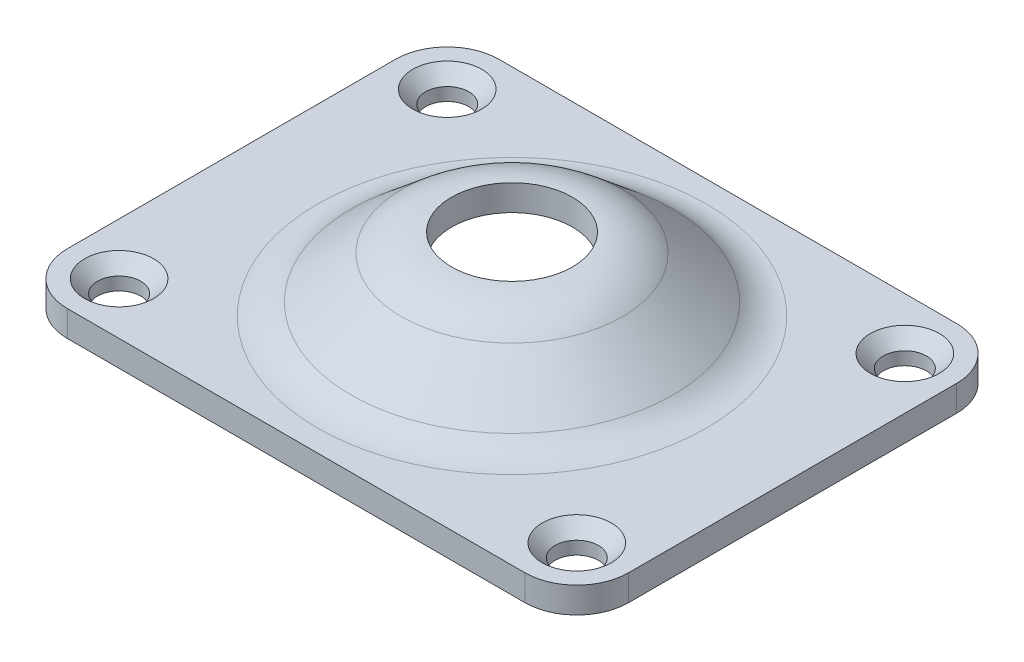
ISO-10303-21;
HEADER;
FILE_DESCRIPTION(('STEP AP214'),'2;1');
FILE_NAME('part.step','',(''),(''),'','','');
FILE_SCHEMA(('AUTOMOTIVE_DESIGN { 1 0 10303 214 1 1 1 1 }'));
ENDSEC;
DATA;
#1=APPLICATION_CONTEXT('core data for automotive mechanical design processes');
#2=APPLICATION_PROTOCOL_DEFINITION('international standard','automotive_design',2000,#1);
#3=PRODUCT_CONTEXT('',#1,'mechanical');
#4=PRODUCT('Part','Part','',(#3));
#5=PRODUCT_RELATED_PRODUCT_CATEGORY('part','',(#4));
#6=PRODUCT_DEFINITION_FORMATION('','',#4);
#7=PRODUCT_DEFINITION_CONTEXT('part definition',#1,'design');
#8=PRODUCT_DEFINITION('design','',#6,#7);
#9=PRODUCT_DEFINITION_SHAPE('','',#8);
#10=(LENGTH_UNIT() NAMED_UNIT(*) SI_UNIT(.MILLI.,.METRE.));
#11=(NAMED_UNIT(*) PLANE_ANGLE_UNIT() SI_UNIT($,.RADIAN.));
#12=(NAMED_UNIT(*) SI_UNIT($,.STERADIAN.) SOLID_ANGLE_UNIT());
#13=UNCERTAINTY_MEASURE_WITH_UNIT(LENGTH_MEASURE(1.E-05),#10,'distance_accuracy_value','');
#14=(GEOMETRIC_REPRESENTATION_CONTEXT(3) GLOBAL_UNCERTAINTY_ASSIGNED_CONTEXT((#13)) GLOBAL_UNIT_ASSIGNED_CONTEXT((#10,
#11,#12)) REPRESENTATION_CONTEXT('',''));
#15=CARTESIAN_POINT('',(0.,0.,0.));
#16=DIRECTION('',(0.,0.,1.));
#17=DIRECTION('',(1.,0.,0.));
#18=AXIS2_PLACEMENT_3D('',#15,#16,#17);
#19=CARTESIAN_POINT('',(-26.5,3.,19.));
#20=DIRECTION('',(0.,1.,0.));
#21=DIRECTION('',(0.,0.,1.));
#22=AXIS2_PLACEMENT_3D('',#19,#20,#21);
#23=PLANE('',#22);
#24=CARTESIAN_POINT('',(-26.5,3.,19.));
#25=DIRECTION('',(0.,1.,0.));
#26=DIRECTION('',(0.,0.,1.));
#27=AXIS2_PLACEMENT_3D('',#24,#25,#26);
#28=CIRCLE('',#27,4.00000000000003);
#29=CARTESIAN_POINT('',(-26.5,3.,23.));
#30=VERTEX_POINT('',#29);
#31=EDGE_CURVE('E212',#30,#30,#28,.F.);
#32=ORIENTED_EDGE('',*,*,#31,.T.);
#33=EDGE_LOOP('',(#32));
#34=FACE_BOUND('',#33,.T.);
#35=CARTESIAN_POINT('',(26.5,3.,19.));
#36=DIRECTION('',(0.,1.,0.));
#37=DIRECTION('',(0.,0.,1.));
#38=AXIS2_PLACEMENT_3D('',#35,#36,#37);
#39=CIRCLE('',#38,4.00000000000003);
#40=CARTESIAN_POINT('',(26.5,3.,23.));
#41=VERTEX_POINT('',#40);
#42=EDGE_CURVE('E208',#41,#41,#39,.F.);
#43=ORIENTED_EDGE('',*,*,#42,.T.);
#44=EDGE_LOOP('',(#43));
#45=FACE_BOUND('',#44,.T.);
#46=CARTESIAN_POINT('',(26.5,3.,-19.));
#47=DIRECTION('',(0.,1.,0.));
#48=DIRECTION('',(0.,0.,1.));
#49=AXIS2_PLACEMENT_3D('',#46,#47,#48);
#50=CIRCLE('',#49,4.00000000000003);
#51=CARTESIAN_POINT('',(26.5,3.,-15.));
#52=VERTEX_POINT('',#51);
#53=EDGE_CURVE('E204',#52,#52,#50,.F.);
#54=ORIENTED_EDGE('',*,*,#53,.T.);
#55=EDGE_LOOP('',(#54));
#56=FACE_BOUND('',#55,.T.);
#57=CARTESIAN_POINT('',(-26.5,3.,-19.));
#58=DIRECTION('',(0.,1.,0.));
#59=DIRECTION('',(0.,0.,1.));
#60=AXIS2_PLACEMENT_3D('',#57,#58,#59);
#61=CIRCLE('',#60,4.00000000000003);
#62=CARTESIAN_POINT('',(-26.5,3.,-15.));
#63=VERTEX_POINT('',#62);
#64=EDGE_CURVE('E200',#63,#63,#61,.F.);
#65=ORIENTED_EDGE('',*,*,#64,.T.);
#66=EDGE_LOOP('',(#65));
#67=FACE_BOUND('',#66,.T.);
#68=CARTESIAN_POINT('',(-26.5,3.,19.));
#69=DIRECTION('',(0.,1.,0.));
#70=DIRECTION('',(0.,0.,1.));
#71=AXIS2_PLACEMENT_3D('',#68,#69,#70);
#72=CIRCLE('',#71,6.);
#73=CARTESIAN_POINT('',(-32.5,3.,19.));
#74=VERTEX_POINT('',#73);
#75=CARTESIAN_POINT('',(-26.5,3.,25.));
#76=VERTEX_POINT('',#75);
#77=EDGE_CURVE('E174',#74,#76,#72,.T.);
#78=ORIENTED_EDGE('',*,*,#77,.T.);
#79=DIRECTION('',(1.,0.,0.));
#80=VECTOR('',#79,1.);
#81=CARTESIAN_POINT('',(-26.5,3.,25.));
#82=LINE('',#81,#80);
#83=CARTESIAN_POINT('',(26.5,3.,25.));
#84=VERTEX_POINT('',#83);
#85=EDGE_CURVE('E110',#76,#84,#82,.T.);
#86=ORIENTED_EDGE('',*,*,#85,.T.);
#87=CARTESIAN_POINT('',(26.5,3.,19.));
#88=DIRECTION('',(0.,1.,0.));
#89=DIRECTION('',(0.,0.,1.));
#90=AXIS2_PLACEMENT_3D('',#87,#88,#89);
#91=CIRCLE('',#90,6.);
#92=CARTESIAN_POINT('',(32.5,3.,19.));
#93=VERTEX_POINT('',#92);
#94=EDGE_CURVE('E332',#84,#93,#91,.T.);
#95=ORIENTED_EDGE('',*,*,#94,.T.);
#96=DIRECTION('',(0.,0.,-1.));
#97=VECTOR('',#96,1.);
#98=CARTESIAN_POINT('',(32.5,3.,-19.));
#99=LINE('',#98,#97);
#100=CARTESIAN_POINT('',(32.5,3.,-19.));
#101=VERTEX_POINT('',#100);
#102=EDGE_CURVE('E335',#93,#101,#99,.T.);
#103=ORIENTED_EDGE('',*,*,#102,.T.);
#104=CARTESIAN_POINT('',(26.5,3.,-19.));
#105=DIRECTION('',(0.,1.,0.));
#106=DIRECTION('',(0.,0.,-1.));
#107=AXIS2_PLACEMENT_3D('',#104,#105,#106);
#108=CIRCLE('',#107,6.);
#109=CARTESIAN_POINT('',(26.5,3.,-25.));
#110=VERTEX_POINT('',#109);
#111=EDGE_CURVE('E129',#101,#110,#108,.T.);
#112=ORIENTED_EDGE('',*,*,#111,.T.);
#113=DIRECTION('',(-1.,0.,0.));
#114=VECTOR('',#113,1.);
#115=CARTESIAN_POINT('',(-26.5,3.,-25.));
#116=LINE('',#115,#114);
#117=CARTESIAN_POINT('',(-26.5,3.,-25.));
#118=VERTEX_POINT('',#117);
#119=EDGE_CURVE('E123',#110,#118,#116,.T.);
#120=ORIENTED_EDGE('',*,*,#119,.T.);
#121=CARTESIAN_POINT('',(-26.5,3.,-19.));
#122=DIRECTION('',(0.,1.,0.));
#123=DIRECTION('',(0.,0.,1.));
#124=AXIS2_PLACEMENT_3D('',#121,#122,#123);
#125=CIRCLE('',#124,6.);
#126=CARTESIAN_POINT('',(-32.5,3.,-19.));
#127=VERTEX_POINT('',#126);
#128=EDGE_CURVE('E127',#118,#127,#125,.T.);
#129=ORIENTED_EDGE('',*,*,#128,.T.);
#130=DIRECTION('',(0.,0.,1.));
#131=VECTOR('',#130,1.);
#132=CARTESIAN_POINT('',(-32.5,3.,-19.));
#133=LINE('',#132,#131);
#134=EDGE_CURVE('E66',#127,#74,#133,.T.);
#135=ORIENTED_EDGE('',*,*,#134,.T.);
#136=EDGE_LOOP('',(#78,#86,#95,#103,#112,#120,#129,#135));
#137=FACE_BOUND('',#136,.T.);
#138=CARTESIAN_POINT('',(0.,3.,0.));
#139=DIRECTION('',(0.,1.,0.));
#140=DIRECTION('',(0.,0.,1.));
#141=AXIS2_PLACEMENT_3D('',#138,#139,#140);
#142=CIRCLE('',#141,22.5);
#143=CARTESIAN_POINT('',(0.,3.,22.5));
#144=VERTEX_POINT('',#143);
#145=EDGE_CURVE('E321',#144,#144,#142,.T.);
#146=ORIENTED_EDGE('',*,*,#145,.F.);
#147=EDGE_LOOP('',(#146));
#148=FACE_BOUND('',#147,.T.);
#149=ADVANCED_FACE('F47',(#34,#45,#56,#67,#137,#148),#23,.T.);
#150=CARTESIAN_POINT('',(-26.5,0.,19.));
#151=DIRECTION('',(0.,1.,0.));
#152=DIRECTION('',(0.,0.,1.));
#153=AXIS2_PLACEMENT_3D('',#150,#151,#152);
#154=PLANE('',#153);
#155=CARTESIAN_POINT('',(-26.5,0.,19.));
#156=DIRECTION('',(0.,1.,0.));
#157=DIRECTION('',(0.,0.,1.));
#158=AXIS2_PLACEMENT_3D('',#155,#156,#157);
#159=CIRCLE('',#158,6.);
#160=CARTESIAN_POINT('',(-32.5,0.,19.));
#161=VERTEX_POINT('',#160);
#162=CARTESIAN_POINT('',(-26.5,0.,25.));
#163=VERTEX_POINT('',#162);
#164=EDGE_CURVE('E151',#161,#163,#159,.T.);
#165=ORIENTED_EDGE('',*,*,#164,.F.);
#166=DIRECTION('',(0.,0.,1.));
#167=VECTOR('',#166,1.);
#168=CARTESIAN_POINT('',(-32.5,0.,-19.));
#169=LINE('',#168,#167);
#170=CARTESIAN_POINT('',(-32.5,0.,-19.));
#171=VERTEX_POINT('',#170);
#172=EDGE_CURVE('E101',#171,#161,#169,.T.);
#173=ORIENTED_EDGE('',*,*,#172,.F.);
#174=CARTESIAN_POINT('',(-26.5,0.,-19.));
#175=DIRECTION('',(0.,1.,0.));
#176=DIRECTION('',(0.,0.,1.));
#177=AXIS2_PLACEMENT_3D('',#174,#175,#176);
#178=CIRCLE('',#177,6.);
#179=CARTESIAN_POINT('',(-26.5,0.,-25.));
#180=VERTEX_POINT('',#179);
#181=EDGE_CURVE('E95',#180,#171,#178,.T.);
#182=ORIENTED_EDGE('',*,*,#181,.F.);
#183=DIRECTION('',(-1.,0.,0.));
#184=VECTOR('',#183,1.);
#185=CARTESIAN_POINT('',(-26.5,0.,-25.));
#186=LINE('',#185,#184);
#187=CARTESIAN_POINT('',(26.5,0.,-25.));
#188=VERTEX_POINT('',#187);
#189=EDGE_CURVE('E138',#188,#180,#186,.T.);
#190=ORIENTED_EDGE('',*,*,#189,.F.);
#191=CARTESIAN_POINT('',(26.5,0.,-19.));
#192=DIRECTION('',(0.,1.,0.));
#193=DIRECTION('',(0.,0.,-1.));
#194=AXIS2_PLACEMENT_3D('',#191,#192,#193);
#195=CIRCLE('',#194,6.);
#196=CARTESIAN_POINT('',(32.5,0.,-19.));
#197=VERTEX_POINT('',#196);
#198=EDGE_CURVE('E165',#197,#188,#195,.T.);
#199=ORIENTED_EDGE('',*,*,#198,.F.);
#200=DIRECTION('',(0.,0.,-1.));
#201=VECTOR('',#200,1.);
#202=CARTESIAN_POINT('',(32.5,0.,-19.));
#203=LINE('',#202,#201);
#204=CARTESIAN_POINT('',(32.5,0.,19.));
#205=VERTEX_POINT('',#204);
#206=EDGE_CURVE('E162',#205,#197,#203,.T.);
#207=ORIENTED_EDGE('',*,*,#206,.F.);
#208=CARTESIAN_POINT('',(26.5,0.,19.));
#209=DIRECTION('',(0.,1.,0.));
#210=DIRECTION('',(0.,0.,1.));
#211=AXIS2_PLACEMENT_3D('',#208,#209,#210);
#212=CIRCLE('',#211,6.);
#213=CARTESIAN_POINT('',(26.5,0.,25.));
#214=VERTEX_POINT('',#213);
#215=EDGE_CURVE('E159',#214,#205,#212,.T.);
#216=ORIENTED_EDGE('',*,*,#215,.F.);
#217=DIRECTION('',(1.,0.,0.));
#218=VECTOR('',#217,1.);
#219=CARTESIAN_POINT('',(-26.5,0.,25.));
#220=LINE('',#219,#218);
#221=EDGE_CURVE('E155',#163,#214,#220,.T.);
#222=ORIENTED_EDGE('',*,*,#221,.F.);
#223=EDGE_LOOP('',(#165,#173,#182,#190,#199,#207,#216,#222));
#224=FACE_BOUND('',#223,.T.);
#225=CARTESIAN_POINT('',(-26.5,0.,-19.));
#226=DIRECTION('',(0.,1.,0.));
#227=DIRECTION('',(0.,0.,1.));
#228=AXIS2_PLACEMENT_3D('',#225,#226,#227);
#229=CIRCLE('',#228,2.5);
#230=CARTESIAN_POINT('',(-26.5,0.,-16.5));
#231=VERTEX_POINT('',#230);
#232=EDGE_CURVE('E156',#231,#231,#229,.T.);
#233=ORIENTED_EDGE('',*,*,#232,.T.);
#234=EDGE_LOOP('',(#233));
#235=FACE_BOUND('',#234,.T.);
#236=CARTESIAN_POINT('',(26.5,0.,-19.));
#237=DIRECTION('',(0.,1.,0.));
#238=DIRECTION('',(0.,0.,1.));
#239=AXIS2_PLACEMENT_3D('',#236,#237,#238);
#240=CIRCLE('',#239,2.5);
#241=CARTESIAN_POINT('',(26.5,0.,-16.5));
#242=VERTEX_POINT('',#241);
#243=EDGE_CURVE('E313',#242,#242,#240,.T.);
#244=ORIENTED_EDGE('',*,*,#243,.T.);
#245=EDGE_LOOP('',(#244));
#246=FACE_BOUND('',#245,.T.);
#247=CARTESIAN_POINT('',(-26.5,0.,19.));
#248=DIRECTION('',(0.,1.,0.));
#249=DIRECTION('',(0.,0.,1.));
#250=AXIS2_PLACEMENT_3D('',#247,#248,#249);
#251=CIRCLE('',#250,2.5);
#252=CARTESIAN_POINT('',(-26.5,0.,21.5));
#253=VERTEX_POINT('',#252);
#254=EDGE_CURVE('E310',#253,#253,#251,.T.);
#255=ORIENTED_EDGE('',*,*,#254,.T.);
#256=EDGE_LOOP('',(#255));
#257=FACE_BOUND('',#256,.T.);
#258=CARTESIAN_POINT('',(26.5,0.,19.));
#259=DIRECTION('',(0.,1.,0.));
#260=DIRECTION('',(0.,0.,1.));
#261=AXIS2_PLACEMENT_3D('',#258,#259,#260);
#262=CIRCLE('',#261,2.5);
#263=CARTESIAN_POINT('',(26.5,0.,21.5));
#264=VERTEX_POINT('',#263);
#265=EDGE_CURVE('E314',#264,#264,#262,.T.);
#266=ORIENTED_EDGE('',*,*,#265,.T.);
#267=EDGE_LOOP('',(#266));
#268=FACE_BOUND('',#267,.T.);
#269=CARTESIAN_POINT('',(0.,0.,0.));
#270=DIRECTION('',(0.,-1.,0.));
#271=DIRECTION('',(0.,0.,-1.));
#272=AXIS2_PLACEMENT_3D('',#269,#270,#271);
#273=CIRCLE('',#272,22.5);
#274=CARTESIAN_POINT('',(0.,0.,-22.5));
#275=VERTEX_POINT('',#274);
#276=EDGE_CURVE('E357',#275,#275,#273,.T.);
#277=ORIENTED_EDGE('',*,*,#276,.F.);
#278=EDGE_LOOP('',(#277));
#279=FACE_BOUND('',#278,.T.);
#280=ADVANCED_FACE('F242',(#224,#235,#246,#257,#268,#279),#154,.F.);
#281=CARTESIAN_POINT('',(-26.5,3.,19.));
#282=DIRECTION('',(0.,-1.,0.));
#283=DIRECTION('',(0.,0.,-1.));
#284=AXIS2_PLACEMENT_3D('',#281,#282,#283);
#285=CYLINDRICAL_SURFACE('',#284,6.);
#286=ORIENTED_EDGE('',*,*,#164,.T.);
#287=DIRECTION('',(0.,-1.,0.));
#288=VECTOR('',#287,1.);
#289=CARTESIAN_POINT('',(-26.5,3.,25.));
#290=LINE('',#289,#288);
#291=EDGE_CURVE('E193',#76,#163,#290,.T.);
#292=ORIENTED_EDGE('',*,*,#291,.F.);
#293=ORIENTED_EDGE('',*,*,#77,.F.);
#294=DIRECTION('',(0.,-1.,0.));
#295=VECTOR('',#294,1.);
#296=CARTESIAN_POINT('',(-32.5,3.,19.));
#297=LINE('',#296,#295);
#298=EDGE_CURVE('E147',#74,#161,#297,.T.);
#299=ORIENTED_EDGE('',*,*,#298,.T.);
#300=EDGE_LOOP('',(#286,#292,#293,#299));
#301=FACE_BOUND('',#300,.T.);
#302=ADVANCED_FACE('F250',(#301),#285,.T.);
#303=CARTESIAN_POINT('',(-26.5,3.,25.));
#304=DIRECTION('',(0.,0.,-1.));
#305=DIRECTION('',(-1.,0.,0.));
#306=AXIS2_PLACEMENT_3D('',#303,#304,#305);
#307=PLANE('',#306);
#308=ORIENTED_EDGE('',*,*,#221,.T.);
#309=DIRECTION('',(0.,-1.,0.));
#310=VECTOR('',#309,1.);
#311=CARTESIAN_POINT('',(26.5,3.,25.));
#312=LINE('',#311,#310);
#313=EDGE_CURVE('E189',#84,#214,#312,.T.);
#314=ORIENTED_EDGE('',*,*,#313,.F.);
#315=ORIENTED_EDGE('',*,*,#85,.F.);
#316=ORIENTED_EDGE('',*,*,#291,.T.);
#317=EDGE_LOOP('',(#308,#314,#315,#316));
#318=FACE_BOUND('',#317,.T.);
#319=ADVANCED_FACE('F275',(#318),#307,.F.);
#320=CARTESIAN_POINT('',(26.5,3.,19.));
#321=DIRECTION('',(0.,-1.,0.));
#322=DIRECTION('',(0.,0.,-1.));
#323=AXIS2_PLACEMENT_3D('',#320,#321,#322);
#324=CYLINDRICAL_SURFACE('',#323,6.);
#325=ORIENTED_EDGE('',*,*,#215,.T.);
#326=DIRECTION('',(0.,-1.,0.));
#327=VECTOR('',#326,1.);
#328=CARTESIAN_POINT('',(32.5,3.,19.));
#329=LINE('',#328,#327);
#330=EDGE_CURVE('E185',#93,#205,#329,.T.);
#331=ORIENTED_EDGE('',*,*,#330,.F.);
#332=ORIENTED_EDGE('',*,*,#94,.F.);
#333=ORIENTED_EDGE('',*,*,#313,.T.);
#334=EDGE_LOOP('',(#325,#331,#332,#333));
#335=FACE_BOUND('',#334,.T.);
#336=ADVANCED_FACE('F271',(#335),#324,.T.);
#337=CARTESIAN_POINT('',(32.5,3.,-19.));
#338=DIRECTION('',(-1.,0.,0.));
#339=DIRECTION('',(0.,0.,1.));
#340=AXIS2_PLACEMENT_3D('',#337,#338,#339);
#341=PLANE('',#340);
#342=ORIENTED_EDGE('',*,*,#206,.T.);
#343=DIRECTION('',(0.,-1.,0.));
#344=VECTOR('',#343,1.);
#345=CARTESIAN_POINT('',(32.5,3.,-19.));
#346=LINE('',#345,#344);
#347=EDGE_CURVE('E181',#101,#197,#346,.T.);
#348=ORIENTED_EDGE('',*,*,#347,.F.);
#349=ORIENTED_EDGE('',*,*,#102,.F.);
#350=ORIENTED_EDGE('',*,*,#330,.T.);
#351=EDGE_LOOP('',(#342,#348,#349,#350));
#352=FACE_BOUND('',#351,.T.);
#353=ADVANCED_FACE('F267',(#352),#341,.F.);
#354=CARTESIAN_POINT('',(26.5,3.,-19.));
#355=DIRECTION('',(0.,-1.,0.));
#356=DIRECTION('',(0.,0.,-1.));
#357=AXIS2_PLACEMENT_3D('',#354,#355,#356);
#358=CYLINDRICAL_SURFACE('',#357,6.);
#359=ORIENTED_EDGE('',*,*,#198,.T.);
#360=DIRECTION('',(0.,-1.,0.));
#361=VECTOR('',#360,1.);
#362=CARTESIAN_POINT('',(26.5,3.,-25.));
#363=LINE('',#362,#361);
#364=EDGE_CURVE('E140',#110,#188,#363,.T.);
#365=ORIENTED_EDGE('',*,*,#364,.F.);
#366=ORIENTED_EDGE('',*,*,#111,.F.);
#367=ORIENTED_EDGE('',*,*,#347,.T.);
#368=EDGE_LOOP('',(#359,#365,#366,#367));
#369=FACE_BOUND('',#368,.T.);
#370=ADVANCED_FACE('F264',(#369),#358,.T.);
#371=CARTESIAN_POINT('',(-26.5,3.,-25.));
#372=DIRECTION('',(0.,0.,1.));
#373=DIRECTION('',(1.,0.,0.));
#374=AXIS2_PLACEMENT_3D('',#371,#372,#373);
#375=PLANE('',#374);
#376=ORIENTED_EDGE('',*,*,#189,.T.);
#377=DIRECTION('',(0.,-1.,0.));
#378=VECTOR('',#377,1.);
#379=CARTESIAN_POINT('',(-26.5,3.,-25.));
#380=LINE('',#379,#378);
#381=EDGE_CURVE('E135',#118,#180,#380,.T.);
#382=ORIENTED_EDGE('',*,*,#381,.F.);
#383=ORIENTED_EDGE('',*,*,#119,.F.);
#384=ORIENTED_EDGE('',*,*,#364,.T.);
#385=EDGE_LOOP('',(#376,#382,#383,#384));
#386=FACE_BOUND('',#385,.T.);
#387=ADVANCED_FACE('F136',(#386),#375,.F.);
#388=CARTESIAN_POINT('',(-26.5,3.,-19.));
#389=DIRECTION('',(0.,-1.,0.));
#390=DIRECTION('',(0.,0.,-1.));
#391=AXIS2_PLACEMENT_3D('',#388,#389,#390);
#392=CYLINDRICAL_SURFACE('',#391,6.);
#393=ORIENTED_EDGE('',*,*,#181,.T.);
#394=DIRECTION('',(0.,-1.,0.));
#395=VECTOR('',#394,1.);
#396=CARTESIAN_POINT('',(-32.5,3.,-19.));
#397=LINE('',#396,#395);
#398=EDGE_CURVE('E141',#127,#171,#397,.T.);
#399=ORIENTED_EDGE('',*,*,#398,.F.);
#400=ORIENTED_EDGE('',*,*,#128,.F.);
#401=ORIENTED_EDGE('',*,*,#381,.T.);
#402=EDGE_LOOP('',(#393,#399,#400,#401));
#403=FACE_BOUND('',#402,.T.);
#404=ADVANCED_FACE('F143',(#403),#392,.T.);
#405=CARTESIAN_POINT('',(-32.5,3.,-19.));
#406=DIRECTION('',(1.,0.,0.));
#407=DIRECTION('',(0.,0.,-1.));
#408=AXIS2_PLACEMENT_3D('',#405,#406,#407);
#409=PLANE('',#408);
#410=ORIENTED_EDGE('',*,*,#172,.T.);
#411=ORIENTED_EDGE('',*,*,#298,.F.);
#412=ORIENTED_EDGE('',*,*,#134,.F.);
#413=ORIENTED_EDGE('',*,*,#398,.T.);
#414=EDGE_LOOP('',(#410,#411,#412,#413));
#415=FACE_BOUND('',#414,.T.);
#416=ADVANCED_FACE('F258',(#415),#409,.F.);
#417=CARTESIAN_POINT('',(-26.5,3.,-19.));
#418=DIRECTION('',(0.,-1.,0.));
#419=DIRECTION('',(0.,0.,-1.));
#420=AXIS2_PLACEMENT_3D('',#417,#418,#419);
#421=CYLINDRICAL_SURFACE('',#420,2.5);
#422=CARTESIAN_POINT('',(-26.5,1.49999999999998,-19.));
#423=DIRECTION('',(0.,1.,0.));
#424=DIRECTION('',(0.,0.,1.));
#425=AXIS2_PLACEMENT_3D('',#422,#423,#424);
#426=CIRCLE('',#425,2.5);
#427=CARTESIAN_POINT('',(-26.5,1.49999999999998,-16.5));
#428=VERTEX_POINT('',#427);
#429=EDGE_CURVE('E11',#428,#428,#426,.T.);
#430=ORIENTED_EDGE('',*,*,#429,.T.);
#431=EDGE_LOOP('',(#430));
#432=FACE_BOUND('',#431,.T.);
#433=ORIENTED_EDGE('',*,*,#232,.F.);
#434=EDGE_LOOP('',(#433));
#435=FACE_BOUND('',#434,.T.);
#436=ADVANCED_FACE('F255',(#432,#435),#421,.F.);
#437=CARTESIAN_POINT('',(26.5,3.,-19.));
#438=DIRECTION('',(0.,-1.,0.));
#439=DIRECTION('',(0.,0.,-1.));
#440=AXIS2_PLACEMENT_3D('',#437,#438,#439);
#441=CYLINDRICAL_SURFACE('',#440,2.5);
#442=CARTESIAN_POINT('',(26.5,1.49999999999998,-19.));
#443=DIRECTION('',(0.,1.,0.));
#444=DIRECTION('',(0.,0.,1.));
#445=AXIS2_PLACEMENT_3D('',#442,#443,#444);
#446=CIRCLE('',#445,2.5);
#447=CARTESIAN_POINT('',(26.5,1.49999999999998,-16.5));
#448=VERTEX_POINT('',#447);
#449=EDGE_CURVE('E58',#448,#448,#446,.T.);
#450=ORIENTED_EDGE('',*,*,#449,.T.);
#451=EDGE_LOOP('',(#450));
#452=FACE_BOUND('',#451,.T.);
#453=ORIENTED_EDGE('',*,*,#243,.F.);
#454=EDGE_LOOP('',(#453));
#455=FACE_BOUND('',#454,.T.);
#456=ADVANCED_FACE('F223',(#452,#455),#441,.F.);
#457=CARTESIAN_POINT('',(-26.5,3.,19.));
#458=DIRECTION('',(0.,-1.,0.));
#459=DIRECTION('',(0.,0.,-1.));
#460=AXIS2_PLACEMENT_3D('',#457,#458,#459);
#461=CYLINDRICAL_SURFACE('',#460,2.5);
#462=CARTESIAN_POINT('',(-26.5,1.49999999999998,19.));
#463=DIRECTION('',(0.,1.,0.));
#464=DIRECTION('',(0.,0.,1.));
#465=AXIS2_PLACEMENT_3D('',#462,#463,#464);
#466=CIRCLE('',#465,2.5);
#467=CARTESIAN_POINT('',(-26.5,1.49999999999998,21.5));
#468=VERTEX_POINT('',#467);
#469=EDGE_CURVE('E196',#468,#468,#466,.T.);
#470=ORIENTED_EDGE('',*,*,#469,.T.);
#471=EDGE_LOOP('',(#470));
#472=FACE_BOUND('',#471,.T.);
#473=ORIENTED_EDGE('',*,*,#254,.F.);
#474=EDGE_LOOP('',(#473));
#475=FACE_BOUND('',#474,.T.);
#476=ADVANCED_FACE('F298',(#472,#475),#461,.F.);
#477=CARTESIAN_POINT('',(26.5,3.,19.));
#478=DIRECTION('',(0.,-1.,0.));
#479=DIRECTION('',(0.,0.,-1.));
#480=AXIS2_PLACEMENT_3D('',#477,#478,#479);
#481=CYLINDRICAL_SURFACE('',#480,2.5);
#482=CARTESIAN_POINT('',(26.5,1.49999999999998,19.));
#483=DIRECTION('',(0.,1.,0.));
#484=DIRECTION('',(0.,0.,1.));
#485=AXIS2_PLACEMENT_3D('',#482,#483,#484);
#486=CIRCLE('',#485,2.5);
#487=CARTESIAN_POINT('',(26.5,1.49999999999998,21.5));
#488=VERTEX_POINT('',#487);
#489=EDGE_CURVE('E216',#488,#488,#486,.T.);
#490=ORIENTED_EDGE('',*,*,#489,.T.);
#491=EDGE_LOOP('',(#490));
#492=FACE_BOUND('',#491,.T.);
#493=ORIENTED_EDGE('',*,*,#265,.F.);
#494=EDGE_LOOP('',(#493));
#495=FACE_BOUND('',#494,.T.);
#496=ADVANCED_FACE('F287',(#492,#495),#481,.F.);
#497=CARTESIAN_POINT('',(-26.5,1.49999999999998,19.));
#498=DIRECTION('',(0.,1.,0.));
#499=DIRECTION('',(0.,0.,1.));
#500=AXIS2_PLACEMENT_3D('',#497,#498,#499);
#501=CONICAL_SURFACE('',#500,2.5,0.78539816339745);
#502=ORIENTED_EDGE('',*,*,#31,.F.);
#503=EDGE_LOOP('',(#502));
#504=FACE_BOUND('',#503,.T.);
#505=ORIENTED_EDGE('',*,*,#469,.F.);
#506=EDGE_LOOP('',(#505));
#507=FACE_BOUND('',#506,.T.);
#508=ADVANCED_FACE('F236',(#504,#507),#501,.F.);
#509=CARTESIAN_POINT('',(26.5,1.49999999999998,19.));
#510=DIRECTION('',(0.,1.,0.));
#511=DIRECTION('',(0.,0.,1.));
#512=AXIS2_PLACEMENT_3D('',#509,#510,#511);
#513=CONICAL_SURFACE('',#512,2.5,0.78539816339745);
#514=ORIENTED_EDGE('',*,*,#42,.F.);
#515=EDGE_LOOP('',(#514));
#516=FACE_BOUND('',#515,.T.);
#517=ORIENTED_EDGE('',*,*,#489,.F.);
#518=EDGE_LOOP('',(#517));
#519=FACE_BOUND('',#518,.T.);
#520=ADVANCED_FACE('F228',(#516,#519),#513,.F.);
#521=CARTESIAN_POINT('',(26.5,1.49999999999998,-19.));
#522=DIRECTION('',(0.,1.,0.));
#523=DIRECTION('',(0.,0.,1.));
#524=AXIS2_PLACEMENT_3D('',#521,#522,#523);
#525=CONICAL_SURFACE('',#524,2.5,0.78539816339745);
#526=ORIENTED_EDGE('',*,*,#53,.F.);
#527=EDGE_LOOP('',(#526));
#528=FACE_BOUND('',#527,.T.);
#529=ORIENTED_EDGE('',*,*,#449,.F.);
#530=EDGE_LOOP('',(#529));
#531=FACE_BOUND('',#530,.T.);
#532=ADVANCED_FACE('F226',(#528,#531),#525,.F.);
#533=CARTESIAN_POINT('',(-26.5,1.49999999999998,-19.));
#534=DIRECTION('',(0.,1.,0.));
#535=DIRECTION('',(0.,0.,1.));
#536=AXIS2_PLACEMENT_3D('',#533,#534,#535);
#537=CONICAL_SURFACE('',#536,2.5,0.78539816339745);
#538=ORIENTED_EDGE('',*,*,#64,.F.);
#539=EDGE_LOOP('',(#538));
#540=FACE_BOUND('',#539,.T.);
#541=ORIENTED_EDGE('',*,*,#429,.F.);
#542=EDGE_LOOP('',(#541));
#543=FACE_BOUND('',#542,.T.);
#544=ADVANCED_FACE('F50',(#540,#543),#537,.F.);
#545=CARTESIAN_POINT('',(0.,2.10560001192919,0.));
#546=DIRECTION('',(0.,-1.,0.));
#547=DIRECTION('',(0.,0.,-1.));
#548=AXIS2_PLACEMENT_3D('',#545,#546,#547);
#549=CONICAL_SURFACE('',#548,16.7149115128211,0.872664625997167);
#550=CARTESIAN_POINT('',(0.,7.02120160197749,0.));
#551=DIRECTION('',(0.,-1.,0.));
#552=DIRECTION('',(0.,0.,-1.));
#553=AXIS2_PLACEMENT_3D('',#550,#551,#552);
#554=CIRCLE('',#553,10.8567256581192);
#555=CARTESIAN_POINT('',(0.,7.02120160197749,-10.8567256581192));
#556=VERTEX_POINT('',#555);
#557=EDGE_CURVE('E382',#556,#556,#554,.T.);
#558=ORIENTED_EDGE('',*,*,#557,.F.);
#559=EDGE_LOOP('',(#558));
#560=FACE_BOUND('',#559,.T.);
#561=CARTESIAN_POINT('',(0.,2.10560001192919,0.));
#562=DIRECTION('',(0.,-1.,0.));
#563=DIRECTION('',(0.,0.,-1.));
#564=AXIS2_PLACEMENT_3D('',#561,#562,#563);
#565=CIRCLE('',#564,16.7149115128211);
#566=CARTESIAN_POINT('',(0.,2.10560001192919,-16.7149115128211));
#567=VERTEX_POINT('',#566);
#568=EDGE_CURVE('E361',#567,#567,#565,.T.);
#569=ORIENTED_EDGE('',*,*,#568,.T.);
#570=EDGE_LOOP('',(#569));
#571=FACE_BOUND('',#570,.T.);
#572=ADVANCED_FACE('F234',(#560,#571),#549,.F.);
#573=CARTESIAN_POINT('',(0.,2.42493494326361,0.));
#574=DIRECTION('',(0.,-1.,0.));
#575=DIRECTION('',(0.,0.,-1.));
#576=AXIS2_PLACEMENT_3D('',#573,#574,#575);
#577=TOROIDAL_SURFACE('',#576,7.,6.);
#578=CARTESIAN_POINT('',(0.,8.42493494326361,0.));
#579=DIRECTION('',(0.,-1.,0.));
#580=DIRECTION('',(0.,0.,-1.));
#581=AXIS2_PLACEMENT_3D('',#578,#579,#580);
#582=CIRCLE('',#581,7.);
#583=CARTESIAN_POINT('',(0.,8.42493494326361,-7.));
#584=VERTEX_POINT('',#583);
#585=EDGE_CURVE('E378',#584,#584,#582,.T.);
#586=ORIENTED_EDGE('',*,*,#585,.F.);
#587=EDGE_LOOP('',(#586));
#588=FACE_BOUND('',#587,.T.);
#589=ORIENTED_EDGE('',*,*,#557,.T.);
#590=EDGE_LOOP('',(#589));
#591=FACE_BOUND('',#590,.T.);
#592=ADVANCED_FACE('F411',(#588,#591),#577,.F.);
#593=CARTESIAN_POINT('',(0.,0.,0.));
#594=DIRECTION('',(0.,-1.,0.));
#595=DIRECTION('',(0.,0.,-1.));
#596=AXIS2_PLACEMENT_3D('',#593,#594,#595);
#597=CYLINDRICAL_SURFACE('',#596,7.);
#598=ORIENTED_EDGE('',*,*,#585,.T.);
#599=EDGE_LOOP('',(#598));
#600=FACE_BOUND('',#599,.T.);
#601=CARTESIAN_POINT('',(0.,11.4249349432636,0.));
#602=DIRECTION('',(0.,-1.,0.));
#603=DIRECTION('',(0.,0.,-1.));
#604=AXIS2_PLACEMENT_3D('',#601,#602,#603);
#605=CIRCLE('',#604,7.);
#606=CARTESIAN_POINT('',(0.,11.4249349432636,-7.));
#607=VERTEX_POINT('',#606);
#608=EDGE_CURVE('E374',#607,#607,#605,.T.);
#609=ORIENTED_EDGE('',*,*,#608,.F.);
#610=EDGE_LOOP('',(#609));
#611=FACE_BOUND('',#610,.T.);
#612=ADVANCED_FACE('F407',(#600,#611),#597,.F.);
#613=CARTESIAN_POINT('',(0.,2.42493494326361,0.));
#614=DIRECTION('',(0.,-1.,0.));
#615=DIRECTION('',(0.,0.,-1.));
#616=AXIS2_PLACEMENT_3D('',#613,#614,#615);
#617=DEGENERATE_TOROIDAL_SURFACE('',#616,7.,9.,.T.);
#618=ORIENTED_EDGE('',*,*,#608,.T.);
#619=EDGE_LOOP('',(#618));
#620=FACE_BOUND('',#619,.T.);
#621=CARTESIAN_POINT('',(0.,9.31933493133442,0.));
#622=DIRECTION('',(0.,-1.,0.));
#623=DIRECTION('',(0.,0.,-1.));
#624=AXIS2_PLACEMENT_3D('',#621,#622,#623);
#625=CIRCLE('',#624,12.7850884871788);
#626=CARTESIAN_POINT('',(0.,9.31933493133442,-12.7850884871788));
#627=VERTEX_POINT('',#626);
#628=EDGE_CURVE('E366',#627,#627,#625,.T.);
#629=ORIENTED_EDGE('',*,*,#628,.F.);
#630=EDGE_LOOP('',(#629));
#631=FACE_BOUND('',#630,.T.);
#632=ADVANCED_FACE('F401',(#620,#631),#617,.T.);
#633=CARTESIAN_POINT('',(0.,4.40373334128612,0.));
#634=DIRECTION('',(0.,-1.,0.));
#635=DIRECTION('',(0.,0.,-1.));
#636=AXIS2_PLACEMENT_3D('',#633,#634,#635);
#637=CONICAL_SURFACE('',#636,18.6432743418807,0.872664625997167);
#638=ORIENTED_EDGE('',*,*,#628,.T.);
#639=EDGE_LOOP('',(#638));
#640=FACE_BOUND('',#639,.T.);
#641=CARTESIAN_POINT('',(0.,4.40373334128612,0.));
#642=DIRECTION('',(0.,-1.,0.));
#643=DIRECTION('',(0.,0.,-1.));
#644=AXIS2_PLACEMENT_3D('',#641,#642,#643);
#645=CIRCLE('',#644,18.6432743418807);
#646=CARTESIAN_POINT('',(0.,4.40373334128612,-18.6432743418807));
#647=VERTEX_POINT('',#646);
#648=EDGE_CURVE('E360',#647,#647,#645,.T.);
#649=ORIENTED_EDGE('',*,*,#648,.F.);
#650=EDGE_LOOP('',(#649));
#651=FACE_BOUND('',#650,.T.);
#652=ADVANCED_FACE('F392',(#640,#651),#637,.T.);
#653=CARTESIAN_POINT('',(0.,9.,0.));
#654=DIRECTION('',(0.,-1.,0.));
#655=DIRECTION('',(0.,0.,-1.));
#656=AXIS2_PLACEMENT_3D('',#653,#654,#655);
#657=TOROIDAL_SURFACE('',#656,22.5,6.);
#658=ORIENTED_EDGE('',*,*,#648,.T.);
#659=EDGE_LOOP('',(#658));
#660=FACE_BOUND('',#659,.T.);
#661=ORIENTED_EDGE('',*,*,#145,.T.);
#662=EDGE_LOOP('',(#661));
#663=FACE_BOUND('',#662,.T.);
#664=ADVANCED_FACE('F389',(#660,#663),#657,.F.);
#665=CARTESIAN_POINT('',(0.,9.,0.));
#666=DIRECTION('',(0.,-1.,0.));
#667=DIRECTION('',(0.,0.,-1.));
#668=AXIS2_PLACEMENT_3D('',#665,#666,#667);
#669=TOROIDAL_SURFACE('',#668,22.5,9.);
#670=ORIENTED_EDGE('',*,*,#568,.F.);
#671=EDGE_LOOP('',(#670));
#672=FACE_BOUND('',#671,.T.);
#673=ORIENTED_EDGE('',*,*,#276,.T.);
#674=EDGE_LOOP('',(#673));
#675=FACE_BOUND('',#674,.T.);
#676=ADVANCED_FACE('F391',(#672,#675),#669,.T.);
#677=CLOSED_SHELL('',(#149,#280,#302,#319,#336,#353,#370,#387,#404,#416,#436,#456,#476,#496,
#508,#520,#532,#544,#572,#592,#612,#632,#652,#664,#676));
#678=MANIFOLD_SOLID_BREP('B2',#677);
#679=ADVANCED_BREP_SHAPE_REPRESENTATION('',(#18,#678),#14);
#680=SHAPE_DEFINITION_REPRESENTATION(#9,#679);
ENDSEC;
END-ISO-10303-21;
